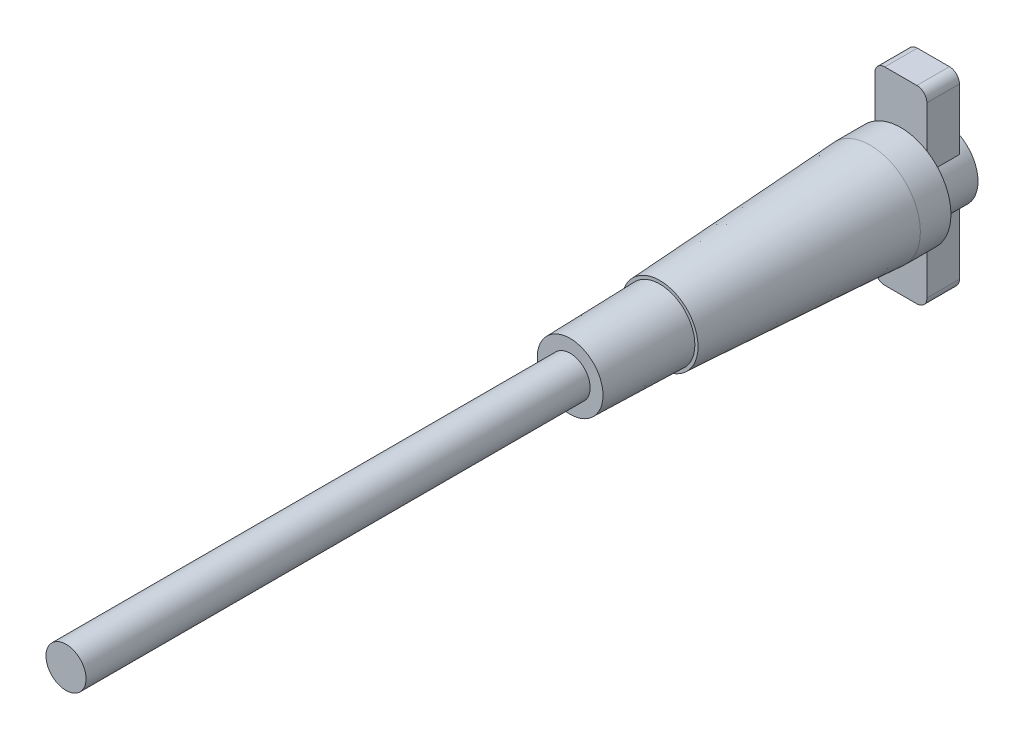
ISO-10303-21;
HEADER;
FILE_DESCRIPTION(('STEP AP214'),'2;1');
FILE_NAME('part.step','',(''),(''),'','','');
FILE_SCHEMA(('AUTOMOTIVE_DESIGN { 1 0 10303 214 1 1 1 1 }'));
ENDSEC;
DATA;
#1=APPLICATION_CONTEXT('core data for automotive mechanical design processes');
#2=APPLICATION_PROTOCOL_DEFINITION('international standard','automotive_design',2000,#1);
#3=PRODUCT_CONTEXT('',#1,'mechanical');
#4=PRODUCT('Part','Part','',(#3));
#5=PRODUCT_RELATED_PRODUCT_CATEGORY('part','',(#4));
#6=PRODUCT_DEFINITION_FORMATION('','',#4);
#7=PRODUCT_DEFINITION_CONTEXT('part definition',#1,'design');
#8=PRODUCT_DEFINITION('design','',#6,#7);
#9=PRODUCT_DEFINITION_SHAPE('','',#8);
#10=(LENGTH_UNIT() NAMED_UNIT(*) SI_UNIT(.MILLI.,.METRE.));
#11=(NAMED_UNIT(*) PLANE_ANGLE_UNIT() SI_UNIT($,.RADIAN.));
#12=(NAMED_UNIT(*) SI_UNIT($,.STERADIAN.) SOLID_ANGLE_UNIT());
#13=UNCERTAINTY_MEASURE_WITH_UNIT(LENGTH_MEASURE(1.E-05),#10,'distance_accuracy_value','');
#14=(GEOMETRIC_REPRESENTATION_CONTEXT(3) GLOBAL_UNCERTAINTY_ASSIGNED_CONTEXT((#13)) GLOBAL_UNIT_ASSIGNED_CONTEXT((#10,
#11,#12)) REPRESENTATION_CONTEXT('',''));
#15=CARTESIAN_POINT('',(0.,0.,0.));
#16=DIRECTION('',(0.,0.,1.));
#17=DIRECTION('',(1.,0.,0.));
#18=AXIS2_PLACEMENT_3D('',#15,#16,#17);
#19=CARTESIAN_POINT('',(0.,0.,88.9));
#20=DIRECTION('',(0.,0.,1.));
#21=DIRECTION('',(1.,0.,0.));
#22=AXIS2_PLACEMENT_3D('',#19,#20,#21);
#23=CYLINDRICAL_SURFACE('',#22,3.556);
#24=CARTESIAN_POINT('',(0.,0.,0.));
#25=DIRECTION('',(0.,0.,1.));
#26=DIRECTION('',(1.,0.,0.));
#27=AXIS2_PLACEMENT_3D('',#24,#25,#26);
#28=CIRCLE('',#27,3.556);
#29=CARTESIAN_POINT('',(3.556,0.,0.));
#30=VERTEX_POINT('',#29);
#31=EDGE_CURVE('E201',#30,#30,#28,.T.);
#32=ORIENTED_EDGE('',*,*,#31,.T.);
#33=EDGE_LOOP('',(#32));
#34=FACE_BOUND('',#33,.T.);
#35=DIRECTION('',(0.,0.,1.));
#36=VECTOR('',#35,1.);
#37=CARTESIAN_POINT('',(-2.6416,2.38056410121635,88.9));
#38=LINE('',#37,#36);
#39=CARTESIAN_POINT('',(-2.6416,2.38056410121635,0.965199999999999));
#40=VERTEX_POINT('',#39);
#41=CARTESIAN_POINT('',(-2.6416,2.38056410121635,4.2672));
#42=VERTEX_POINT('',#41);
#43=EDGE_CURVE('E173',#40,#42,#38,.T.);
#44=ORIENTED_EDGE('',*,*,#43,.F.);
#45=CARTESIAN_POINT('',(0.,0.,0.965199999999999));
#46=DIRECTION('',(0.,0.,-1.));
#47=DIRECTION('',(-1.,0.,0.));
#48=AXIS2_PLACEMENT_3D('',#45,#46,#47);
#49=CIRCLE('',#48,3.556);
#50=CARTESIAN_POINT('',(2.6416,2.38056410121635,0.965199999999999));
#51=VERTEX_POINT('',#50);
#52=EDGE_CURVE('E11',#40,#51,#49,.T.);
#53=ORIENTED_EDGE('',*,*,#52,.T.);
#54=DIRECTION('',(0.,0.,1.));
#55=VECTOR('',#54,1.);
#56=CARTESIAN_POINT('',(2.6416,2.38056410121635,88.9));
#57=LINE('',#56,#55);
#58=CARTESIAN_POINT('',(2.6416,2.38056410121635,4.2672));
#59=VERTEX_POINT('',#58);
#60=EDGE_CURVE('E161',#59,#51,#57,.F.);
#61=ORIENTED_EDGE('',*,*,#60,.F.);
#62=CARTESIAN_POINT('',(0.,0.,4.2672));
#63=DIRECTION('',(0.,0.,1.));
#64=DIRECTION('',(1.,0.,0.));
#65=AXIS2_PLACEMENT_3D('',#62,#63,#64);
#66=CIRCLE('',#65,3.556);
#67=CARTESIAN_POINT('',(2.6416,-2.38056410121635,4.2672));
#68=VERTEX_POINT('',#67);
#69=EDGE_CURVE('E197',#68,#59,#66,.T.);
#70=ORIENTED_EDGE('',*,*,#69,.F.);
#71=DIRECTION('',(0.,0.,1.));
#72=VECTOR('',#71,1.);
#73=CARTESIAN_POINT('',(2.6416,-2.38056410121635,88.9));
#74=LINE('',#73,#72);
#75=CARTESIAN_POINT('',(2.6416,-2.38056410121635,0.965199999999999));
#76=VERTEX_POINT('',#75);
#77=EDGE_CURVE('E164',#76,#68,#74,.T.);
#78=ORIENTED_EDGE('',*,*,#77,.F.);
#79=CARTESIAN_POINT('',(-2.6416,-2.38056410121635,0.965199999999999));
#80=VERTEX_POINT('',#79);
#81=EDGE_CURVE('E37',#76,#80,#49,.T.);
#82=ORIENTED_EDGE('',*,*,#81,.T.);
#83=DIRECTION('',(0.,0.,1.));
#84=VECTOR('',#83,1.);
#85=CARTESIAN_POINT('',(-2.6416,-2.38056410121635,88.9));
#86=LINE('',#85,#84);
#87=CARTESIAN_POINT('',(-2.6416,-2.38056410121635,4.2672));
#88=VERTEX_POINT('',#87);
#89=EDGE_CURVE('E142',#88,#80,#86,.F.);
#90=ORIENTED_EDGE('',*,*,#89,.F.);
#91=EDGE_CURVE('E200',#42,#88,#66,.T.);
#92=ORIENTED_EDGE('',*,*,#91,.F.);
#93=EDGE_LOOP('',(#44,#53,#61,#70,#78,#82,#90,#92));
#94=FACE_BOUND('',#93,.T.);
#95=ADVANCED_FACE('F33',(#34,#94),#23,.T.);
#96=CARTESIAN_POINT('',(0.,3.556,4.2672));
#97=DIRECTION('',(0.,0.,1.));
#98=DIRECTION('',(1.,0.,0.));
#99=AXIS2_PLACEMENT_3D('',#96,#97,#98);
#100=PLANE('',#99);
#101=DIRECTION('',(0.,1.,0.));
#102=VECTOR('',#101,1.);
#103=CARTESIAN_POINT('',(-2.6416,-8.5725,4.2672));
#104=LINE('',#103,#102);
#105=CARTESIAN_POINT('',(-2.6416,-4.33916460162553,4.2672));
#106=VERTEX_POINT('',#105);
#107=EDGE_CURVE('E211',#106,#88,#104,.T.);
#108=ORIENTED_EDGE('',*,*,#107,.F.);
#109=CARTESIAN_POINT('',(0.,0.,4.2672));
#110=DIRECTION('',(0.,0.,1.));
#111=DIRECTION('',(1.,0.,0.));
#112=AXIS2_PLACEMENT_3D('',#109,#110,#111);
#113=CIRCLE('',#112,5.08);
#114=CARTESIAN_POINT('',(-2.6416,4.33916460162553,4.2672));
#115=VERTEX_POINT('',#114);
#116=EDGE_CURVE('E198',#115,#106,#113,.T.);
#117=ORIENTED_EDGE('',*,*,#116,.F.);
#118=EDGE_CURVE('E56',#42,#115,#104,.T.);
#119=ORIENTED_EDGE('',*,*,#118,.F.);
#120=ORIENTED_EDGE('',*,*,#91,.T.);
#121=EDGE_LOOP('',(#108,#117,#119,#120));
#122=FACE_BOUND('',#121,.T.);
#123=ADVANCED_FACE('F209',(#122),#100,.F.);
#124=DIRECTION('',(0.,-1.,0.));
#125=VECTOR('',#124,1.);
#126=CARTESIAN_POINT('',(2.6416,-8.5725,4.2672));
#127=LINE('',#126,#125);
#128=CARTESIAN_POINT('',(2.6416,4.33916460162553,4.2672));
#129=VERTEX_POINT('',#128);
#130=EDGE_CURVE('E251',#129,#59,#127,.T.);
#131=ORIENTED_EDGE('',*,*,#130,.F.);
#132=CARTESIAN_POINT('',(2.6416,-4.33916460162553,4.2672));
#133=VERTEX_POINT('',#132);
#134=EDGE_CURVE('E193',#133,#129,#113,.T.);
#135=ORIENTED_EDGE('',*,*,#134,.F.);
#136=EDGE_CURVE('E48',#68,#133,#127,.T.);
#137=ORIENTED_EDGE('',*,*,#136,.F.);
#138=ORIENTED_EDGE('',*,*,#69,.T.);
#139=EDGE_LOOP('',(#131,#135,#137,#138));
#140=FACE_BOUND('',#139,.T.);
#141=ADVANCED_FACE('F291',(#140),#100,.F.);
#142=CARTESIAN_POINT('',(0.,0.,0.));
#143=DIRECTION('',(0.,0.,1.));
#144=DIRECTION('',(1.,0.,0.));
#145=AXIS2_PLACEMENT_3D('',#142,#143,#144);
#146=PLANE('',#145);
#147=ORIENTED_EDGE('',*,*,#31,.F.);
#148=EDGE_LOOP('',(#147));
#149=FACE_BOUND('',#148,.T.);
#150=ADVANCED_FACE('F35',(#149),#146,.F.);
#151=CARTESIAN_POINT('',(0.,0.,88.9));
#152=DIRECTION('',(0.,0.,1.));
#153=DIRECTION('',(1.,0.,0.));
#154=AXIS2_PLACEMENT_3D('',#151,#152,#153);
#155=CYLINDRICAL_SURFACE('',#154,5.08);
#156=CARTESIAN_POINT('',(0.,0.,7.366));
#157=DIRECTION('',(0.,0.,1.));
#158=DIRECTION('',(1.,0.,0.));
#159=AXIS2_PLACEMENT_3D('',#156,#157,#158);
#160=CIRCLE('',#159,5.08);
#161=CARTESIAN_POINT('',(5.08,0.,7.366));
#162=VERTEX_POINT('',#161);
#163=EDGE_CURVE('E190',#162,#162,#160,.T.);
#164=ORIENTED_EDGE('',*,*,#163,.F.);
#165=EDGE_LOOP('',(#164));
#166=FACE_BOUND('',#165,.T.);
#167=EDGE_CURVE('E194',#129,#115,#113,.T.);
#168=ORIENTED_EDGE('',*,*,#167,.T.);
#169=ORIENTED_EDGE('',*,*,#116,.T.);
#170=EDGE_CURVE('E515',#106,#133,#113,.T.);
#171=ORIENTED_EDGE('',*,*,#170,.T.);
#172=ORIENTED_EDGE('',*,*,#134,.T.);
#173=EDGE_LOOP('',(#168,#169,#171,#172));
#174=FACE_BOUND('',#173,.T.);
#175=ADVANCED_FACE('F320',(#166,#174),#155,.T.);
#176=CARTESIAN_POINT('',(0.,0.,7.366));
#177=DIRECTION('',(0.,0.,-1.));
#178=DIRECTION('',(-1.,0.,0.));
#179=AXIS2_PLACEMENT_3D('',#176,#177,#178);
#180=CONICAL_SURFACE('',#179,5.08,0.056487461574039);
#181=CARTESIAN_POINT('',(0.,0.,28.702));
#182=DIRECTION('',(0.,0.,1.));
#183=DIRECTION('',(1.,0.,0.));
#184=AXIS2_PLACEMENT_3D('',#181,#182,#183);
#185=CIRCLE('',#184,3.8735);
#186=CARTESIAN_POINT('',(3.8735,0.,28.702));
#187=VERTEX_POINT('',#186);
#188=EDGE_CURVE('E187',#187,#187,#185,.T.);
#189=ORIENTED_EDGE('',*,*,#188,.F.);
#190=EDGE_LOOP('',(#189));
#191=FACE_BOUND('',#190,.T.);
#192=ORIENTED_EDGE('',*,*,#163,.T.);
#193=EDGE_LOOP('',(#192));
#194=FACE_BOUND('',#193,.T.);
#195=ADVANCED_FACE('F323',(#191,#194),#180,.T.);
#196=CARTESIAN_POINT('',(0.,3.8735,28.702));
#197=DIRECTION('',(0.,0.,-1.));
#198=DIRECTION('',(-1.,0.,0.));
#199=AXIS2_PLACEMENT_3D('',#196,#197,#198);
#200=PLANE('',#199);
#201=CARTESIAN_POINT('',(0.,0.,28.702));
#202=DIRECTION('',(0.,0.,1.));
#203=DIRECTION('',(1.,0.,0.));
#204=AXIS2_PLACEMENT_3D('',#201,#202,#203);
#205=CIRCLE('',#204,3.556);
#206=CARTESIAN_POINT('',(3.556,0.,28.702));
#207=VERTEX_POINT('',#206);
#208=EDGE_CURVE('E184',#207,#207,#205,.T.);
#209=ORIENTED_EDGE('',*,*,#208,.F.);
#210=EDGE_LOOP('',(#209));
#211=FACE_BOUND('',#210,.T.);
#212=ORIENTED_EDGE('',*,*,#188,.T.);
#213=EDGE_LOOP('',(#212));
#214=FACE_BOUND('',#213,.T.);
#215=ADVANCED_FACE('F327',(#211,#214),#200,.F.);
#216=CARTESIAN_POINT('',(0.,0.,28.702));
#217=DIRECTION('',(0.,0.,-1.));
#218=DIRECTION('',(-1.,0.,0.));
#219=AXIS2_PLACEMENT_3D('',#216,#217,#218);
#220=CONICAL_SURFACE('',#219,3.556,0.0244364756101101);
#221=CARTESIAN_POINT('',(0.,0.,37.7952));
#222=DIRECTION('',(0.,0.,1.));
#223=DIRECTION('',(1.,0.,0.));
#224=AXIS2_PLACEMENT_3D('',#221,#222,#223);
#225=CIRCLE('',#224,3.33374999999999);
#226=CARTESIAN_POINT('',(3.33374999999999,0.,37.7952));
#227=VERTEX_POINT('',#226);
#228=EDGE_CURVE('E181',#227,#227,#225,.T.);
#229=ORIENTED_EDGE('',*,*,#228,.F.);
#230=EDGE_LOOP('',(#229));
#231=FACE_BOUND('',#230,.T.);
#232=ORIENTED_EDGE('',*,*,#208,.T.);
#233=EDGE_LOOP('',(#232));
#234=FACE_BOUND('',#233,.T.);
#235=ADVANCED_FACE('F331',(#231,#234),#220,.T.);
#236=CARTESIAN_POINT('',(0.,3.33374999999999,37.7952));
#237=DIRECTION('',(0.,0.,-1.));
#238=DIRECTION('',(-1.,0.,0.));
#239=AXIS2_PLACEMENT_3D('',#236,#237,#238);
#240=PLANE('',#239);
#241=CARTESIAN_POINT('',(0.,0.,37.7952));
#242=DIRECTION('',(0.,0.,1.));
#243=DIRECTION('',(1.,0.,0.));
#244=AXIS2_PLACEMENT_3D('',#241,#242,#243);
#245=CIRCLE('',#244,2.03200000000001);
#246=CARTESIAN_POINT('',(2.03200000000001,0.,37.7952));
#247=VERTEX_POINT('',#246);
#248=EDGE_CURVE('E178',#247,#247,#245,.T.);
#249=ORIENTED_EDGE('',*,*,#248,.F.);
#250=EDGE_LOOP('',(#249));
#251=FACE_BOUND('',#250,.T.);
#252=ORIENTED_EDGE('',*,*,#228,.T.);
#253=EDGE_LOOP('',(#252));
#254=FACE_BOUND('',#253,.T.);
#255=ADVANCED_FACE('F335',(#251,#254),#240,.F.);
#256=CARTESIAN_POINT('',(0.,0.,88.9));
#257=DIRECTION('',(0.,0.,1.));
#258=DIRECTION('',(1.,0.,0.));
#259=AXIS2_PLACEMENT_3D('',#256,#257,#258);
#260=CYLINDRICAL_SURFACE('',#259,2.032);
#261=CARTESIAN_POINT('',(0.,0.,88.9));
#262=DIRECTION('',(0.,0.,1.));
#263=DIRECTION('',(1.,0.,0.));
#264=AXIS2_PLACEMENT_3D('',#261,#262,#263);
#265=CIRCLE('',#264,2.03199999999999);
#266=CARTESIAN_POINT('',(2.03199999999999,0.,88.9));
#267=VERTEX_POINT('',#266);
#268=EDGE_CURVE('E175',#267,#267,#265,.T.);
#269=ORIENTED_EDGE('',*,*,#268,.F.);
#270=EDGE_LOOP('',(#269));
#271=FACE_BOUND('',#270,.T.);
#272=ORIENTED_EDGE('',*,*,#248,.T.);
#273=EDGE_LOOP('',(#272));
#274=FACE_BOUND('',#273,.T.);
#275=ADVANCED_FACE('F339',(#271,#274),#260,.T.);
#276=CARTESIAN_POINT('',(0.,2.03199999999999,88.9));
#277=DIRECTION('',(0.,0.,-1.));
#278=DIRECTION('',(-1.,0.,0.));
#279=AXIS2_PLACEMENT_3D('',#276,#277,#278);
#280=PLANE('',#279);
#281=ORIENTED_EDGE('',*,*,#268,.T.);
#282=EDGE_LOOP('',(#281));
#283=FACE_BOUND('',#282,.T.);
#284=ADVANCED_FACE('F311',(#283),#280,.F.);
#285=CARTESIAN_POINT('',(1.6256,-8.5725,0.965200000000001));
#286=DIRECTION('',(0.,0.,1.));
#287=DIRECTION('',(1.,0.,0.));
#288=AXIS2_PLACEMENT_3D('',#285,#286,#287);
#289=CYLINDRICAL_SURFACE('',#288,1.016);
#290=CARTESIAN_POINT('',(1.6256,-8.5725,4.2672));
#291=DIRECTION('',(0.,0.,-1.));
#292=DIRECTION('',(1.,0.,0.));
#293=AXIS2_PLACEMENT_3D('',#290,#291,#292);
#294=CIRCLE('',#293,1.016);
#295=CARTESIAN_POINT('',(2.6416,-8.5725,4.2672));
#296=VERTEX_POINT('',#295);
#297=CARTESIAN_POINT('',(1.6256,-9.5885,4.2672));
#298=VERTEX_POINT('',#297);
#299=EDGE_CURVE('E250',#296,#298,#294,.T.);
#300=ORIENTED_EDGE('',*,*,#299,.T.);
#301=DIRECTION('',(0.,0.,1.));
#302=VECTOR('',#301,1.);
#303=CARTESIAN_POINT('',(1.6256,-9.5885,0.965200000000001));
#304=LINE('',#303,#302);
#305=CARTESIAN_POINT('',(1.6256,-9.5885,0.965200000000001));
#306=VERTEX_POINT('',#305);
#307=EDGE_CURVE('E255',#306,#298,#304,.T.);
#308=ORIENTED_EDGE('',*,*,#307,.F.);
#309=CARTESIAN_POINT('',(1.6256,-8.5725,0.965200000000001));
#310=DIRECTION('',(0.,0.,-1.));
#311=DIRECTION('',(1.,0.,0.));
#312=AXIS2_PLACEMENT_3D('',#309,#310,#311);
#313=CIRCLE('',#312,1.016);
#314=CARTESIAN_POINT('',(2.6416,-8.5725,0.965200000000001));
#315=VERTEX_POINT('',#314);
#316=EDGE_CURVE('E228',#315,#306,#313,.T.);
#317=ORIENTED_EDGE('',*,*,#316,.F.);
#318=DIRECTION('',(0.,0.,1.));
#319=VECTOR('',#318,1.);
#320=CARTESIAN_POINT('',(2.6416,-8.5725,0.965200000000001));
#321=LINE('',#320,#319);
#322=EDGE_CURVE('E222',#315,#296,#321,.T.);
#323=ORIENTED_EDGE('',*,*,#322,.T.);
#324=EDGE_LOOP('',(#300,#308,#317,#323));
#325=FACE_BOUND('',#324,.T.);
#326=ADVANCED_FACE('F298',(#325),#289,.T.);
#327=CARTESIAN_POINT('',(1.6256,-9.5885,0.965200000000001));
#328=DIRECTION('',(0.,1.,0.));
#329=DIRECTION('',(0.,0.,1.));
#330=AXIS2_PLACEMENT_3D('',#327,#328,#329);
#331=PLANE('',#330);
#332=DIRECTION('',(-1.,0.,0.));
#333=VECTOR('',#332,1.);
#334=CARTESIAN_POINT('',(1.6256,-9.5885,4.2672));
#335=LINE('',#334,#333);
#336=CARTESIAN_POINT('',(-1.6256,-9.5885,4.2672));
#337=VERTEX_POINT('',#336);
#338=EDGE_CURVE('E156',#298,#337,#335,.T.);
#339=ORIENTED_EDGE('',*,*,#338,.T.);
#340=DIRECTION('',(0.,0.,1.));
#341=VECTOR('',#340,1.);
#342=CARTESIAN_POINT('',(-1.6256,-9.5885,0.965200000000001));
#343=LINE('',#342,#341);
#344=CARTESIAN_POINT('',(-1.6256,-9.5885,0.965200000000001));
#345=VERTEX_POINT('',#344);
#346=EDGE_CURVE('E235',#345,#337,#343,.T.);
#347=ORIENTED_EDGE('',*,*,#346,.F.);
#348=DIRECTION('',(-1.,0.,0.));
#349=VECTOR('',#348,1.);
#350=CARTESIAN_POINT('',(1.6256,-9.5885,0.965200000000001));
#351=LINE('',#350,#349);
#352=EDGE_CURVE('E152',#306,#345,#351,.T.);
#353=ORIENTED_EDGE('',*,*,#352,.F.);
#354=ORIENTED_EDGE('',*,*,#307,.T.);
#355=EDGE_LOOP('',(#339,#347,#353,#354));
#356=FACE_BOUND('',#355,.T.);
#357=ADVANCED_FACE('F303',(#356),#331,.F.);
#358=CARTESIAN_POINT('',(-1.6256,-8.5725,0.965200000000001));
#359=DIRECTION('',(0.,0.,1.));
#360=DIRECTION('',(1.,0.,0.));
#361=AXIS2_PLACEMENT_3D('',#358,#359,#360);
#362=CYLINDRICAL_SURFACE('',#361,1.016);
#363=CARTESIAN_POINT('',(-1.6256,-8.5725,4.2672));
#364=DIRECTION('',(0.,0.,-1.));
#365=DIRECTION('',(-1.,0.,0.));
#366=AXIS2_PLACEMENT_3D('',#363,#364,#365);
#367=CIRCLE('',#366,1.016);
#368=CARTESIAN_POINT('',(-2.6416,-8.5725,4.2672));
#369=VERTEX_POINT('',#368);
#370=EDGE_CURVE('E160',#337,#369,#367,.T.);
#371=ORIENTED_EDGE('',*,*,#370,.T.);
#372=DIRECTION('',(0.,0.,1.));
#373=VECTOR('',#372,1.);
#374=CARTESIAN_POINT('',(-2.6416,-8.5725,0.965200000000001));
#375=LINE('',#374,#373);
#376=CARTESIAN_POINT('',(-2.6416,-8.5725,0.965200000000001));
#377=VERTEX_POINT('',#376);
#378=EDGE_CURVE('E139',#377,#369,#375,.T.);
#379=ORIENTED_EDGE('',*,*,#378,.F.);
#380=CARTESIAN_POINT('',(-1.6256,-8.5725,0.965200000000001));
#381=DIRECTION('',(0.,0.,-1.));
#382=DIRECTION('',(-1.,0.,0.));
#383=AXIS2_PLACEMENT_3D('',#380,#381,#382);
#384=CIRCLE('',#383,1.016);
#385=EDGE_CURVE('E149',#345,#377,#384,.T.);
#386=ORIENTED_EDGE('',*,*,#385,.F.);
#387=ORIENTED_EDGE('',*,*,#346,.T.);
#388=EDGE_LOOP('',(#371,#379,#386,#387));
#389=FACE_BOUND('',#388,.T.);
#390=ADVANCED_FACE('F158',(#389),#362,.T.);
#391=CARTESIAN_POINT('',(-1.6256,-8.5725,4.2672));
#392=DIRECTION('',(0.,0.,-1.));
#393=DIRECTION('',(-1.,0.,0.));
#394=AXIS2_PLACEMENT_3D('',#391,#392,#393);
#395=PLANE('',#394);
#396=EDGE_CURVE('E246',#133,#296,#127,.T.);
#397=ORIENTED_EDGE('',*,*,#396,.F.);
#398=ORIENTED_EDGE('',*,*,#170,.F.);
#399=EDGE_CURVE('E238',#369,#106,#104,.T.);
#400=ORIENTED_EDGE('',*,*,#399,.F.);
#401=ORIENTED_EDGE('',*,*,#370,.F.);
#402=ORIENTED_EDGE('',*,*,#338,.F.);
#403=ORIENTED_EDGE('',*,*,#299,.F.);
#404=EDGE_LOOP('',(#397,#398,#400,#401,#402,#403));
#405=FACE_BOUND('',#404,.T.);
#406=ADVANCED_FACE('F301',(#405),#395,.F.);
#407=CARTESIAN_POINT('',(2.6416,-8.5725,0.965200000000001));
#408=DIRECTION('',(-1.,0.,0.));
#409=DIRECTION('',(0.,0.,1.));
#410=AXIS2_PLACEMENT_3D('',#407,#408,#409);
#411=PLANE('',#410);
#412=DIRECTION('',(0.,-1.,0.));
#413=VECTOR('',#412,1.);
#414=CARTESIAN_POINT('',(2.6416,-8.5725,0.965200000000001));
#415=LINE('',#414,#413);
#416=EDGE_CURVE('E218',#76,#315,#415,.T.);
#417=ORIENTED_EDGE('',*,*,#416,.F.);
#418=ORIENTED_EDGE('',*,*,#77,.T.);
#419=ORIENTED_EDGE('',*,*,#136,.T.);
#420=ORIENTED_EDGE('',*,*,#396,.T.);
#421=ORIENTED_EDGE('',*,*,#322,.F.);
#422=EDGE_LOOP('',(#417,#418,#419,#420,#421));
#423=FACE_BOUND('',#422,.T.);
#424=ADVANCED_FACE('F220',(#423),#411,.F.);
#425=CARTESIAN_POINT('',(-2.6416,-8.5725,0.965200000000001));
#426=DIRECTION('',(1.,0.,0.));
#427=DIRECTION('',(0.,0.,-1.));
#428=AXIS2_PLACEMENT_3D('',#425,#426,#427);
#429=PLANE('',#428);
#430=ORIENTED_EDGE('',*,*,#107,.T.);
#431=ORIENTED_EDGE('',*,*,#89,.T.);
#432=DIRECTION('',(0.,1.,0.));
#433=VECTOR('',#432,1.);
#434=CARTESIAN_POINT('',(-2.6416,-8.5725,0.965200000000001));
#435=LINE('',#434,#433);
#436=EDGE_CURVE('E134',#377,#80,#435,.T.);
#437=ORIENTED_EDGE('',*,*,#436,.F.);
#438=ORIENTED_EDGE('',*,*,#378,.T.);
#439=ORIENTED_EDGE('',*,*,#399,.T.);
#440=EDGE_LOOP('',(#430,#431,#437,#438,#439));
#441=FACE_BOUND('',#440,.T.);
#442=ADVANCED_FACE('F136',(#441),#429,.F.);
#443=CARTESIAN_POINT('',(-1.6256,-8.5725,0.965200000000001));
#444=DIRECTION('',(0.,0.,-1.));
#445=DIRECTION('',(-1.,0.,0.));
#446=AXIS2_PLACEMENT_3D('',#443,#444,#445);
#447=PLANE('',#446);
#448=ORIENTED_EDGE('',*,*,#81,.F.);
#449=ORIENTED_EDGE('',*,*,#416,.T.);
#450=ORIENTED_EDGE('',*,*,#316,.T.);
#451=ORIENTED_EDGE('',*,*,#352,.T.);
#452=ORIENTED_EDGE('',*,*,#385,.T.);
#453=ORIENTED_EDGE('',*,*,#436,.T.);
#454=EDGE_LOOP('',(#448,#449,#450,#451,#452,#453));
#455=FACE_BOUND('',#454,.T.);
#456=ADVANCED_FACE('F150',(#455),#447,.T.);
#457=ORIENTED_EDGE('',*,*,#52,.F.);
#458=CARTESIAN_POINT('',(-2.6416,8.5725,0.965200000000001));
#459=VERTEX_POINT('',#458);
#460=EDGE_CURVE('E146',#40,#459,#435,.T.);
#461=ORIENTED_EDGE('',*,*,#460,.T.);
#462=CARTESIAN_POINT('',(-1.6256,8.5725,0.965200000000001));
#463=DIRECTION('',(0.,0.,-1.));
#464=DIRECTION('',(1.,0.,0.));
#465=AXIS2_PLACEMENT_3D('',#462,#463,#464);
#466=CIRCLE('',#465,1.016);
#467=CARTESIAN_POINT('',(-1.6256,9.5885,0.965200000000001));
#468=VERTEX_POINT('',#467);
#469=EDGE_CURVE('E145',#459,#468,#466,.T.);
#470=ORIENTED_EDGE('',*,*,#469,.T.);
#471=DIRECTION('',(1.,0.,0.));
#472=VECTOR('',#471,1.);
#473=CARTESIAN_POINT('',(1.6256,9.5885,0.965200000000001));
#474=LINE('',#473,#472);
#475=CARTESIAN_POINT('',(1.6256,9.5885,0.965200000000001));
#476=VERTEX_POINT('',#475);
#477=EDGE_CURVE('E229',#468,#476,#474,.T.);
#478=ORIENTED_EDGE('',*,*,#477,.T.);
#479=CARTESIAN_POINT('',(1.6256,8.5725,0.965200000000001));
#480=DIRECTION('',(0.,0.,-1.));
#481=DIRECTION('',(1.,0.,0.));
#482=AXIS2_PLACEMENT_3D('',#479,#480,#481);
#483=CIRCLE('',#482,1.016);
#484=CARTESIAN_POINT('',(2.6416,8.5725,0.965200000000001));
#485=VERTEX_POINT('',#484);
#486=EDGE_CURVE('E225',#476,#485,#483,.T.);
#487=ORIENTED_EDGE('',*,*,#486,.T.);
#488=EDGE_CURVE('E224',#485,#51,#415,.T.);
#489=ORIENTED_EDGE('',*,*,#488,.T.);
#490=EDGE_LOOP('',(#457,#461,#470,#478,#487,#489));
#491=FACE_BOUND('',#490,.T.);
#492=ADVANCED_FACE('F288',(#491),#447,.T.);
#493=ORIENTED_EDGE('',*,*,#460,.F.);
#494=ORIENTED_EDGE('',*,*,#43,.T.);
#495=ORIENTED_EDGE('',*,*,#118,.T.);
#496=CARTESIAN_POINT('',(-2.6416,8.5725,4.2672));
#497=VERTEX_POINT('',#496);
#498=EDGE_CURVE('E237',#115,#497,#104,.T.);
#499=ORIENTED_EDGE('',*,*,#498,.T.);
#500=DIRECTION('',(0.,0.,1.));
#501=VECTOR('',#500,1.);
#502=CARTESIAN_POINT('',(-2.6416,8.5725,0.965200000000001));
#503=LINE('',#502,#501);
#504=EDGE_CURVE('E162',#459,#497,#503,.T.);
#505=ORIENTED_EDGE('',*,*,#504,.F.);
#506=EDGE_LOOP('',(#493,#494,#495,#499,#505));
#507=FACE_BOUND('',#506,.T.);
#508=ADVANCED_FACE('F347',(#507),#429,.F.);
#509=ORIENTED_EDGE('',*,*,#130,.T.);
#510=ORIENTED_EDGE('',*,*,#60,.T.);
#511=ORIENTED_EDGE('',*,*,#488,.F.);
#512=DIRECTION('',(0.,0.,1.));
#513=VECTOR('',#512,1.);
#514=CARTESIAN_POINT('',(2.6416,8.5725,0.965200000000001));
#515=LINE('',#514,#513);
#516=CARTESIAN_POINT('',(2.6416,8.5725,4.2672));
#517=VERTEX_POINT('',#516);
#518=EDGE_CURVE('E259',#485,#517,#515,.T.);
#519=ORIENTED_EDGE('',*,*,#518,.T.);
#520=EDGE_CURVE('E247',#517,#129,#127,.T.);
#521=ORIENTED_EDGE('',*,*,#520,.T.);
#522=EDGE_LOOP('',(#509,#510,#511,#519,#521));
#523=FACE_BOUND('',#522,.T.);
#524=ADVANCED_FACE('F284',(#523),#411,.F.);
#525=ORIENTED_EDGE('',*,*,#498,.F.);
#526=ORIENTED_EDGE('',*,*,#167,.F.);
#527=ORIENTED_EDGE('',*,*,#520,.F.);
#528=CARTESIAN_POINT('',(1.6256,8.5725,4.2672));
#529=DIRECTION('',(0.,0.,-1.));
#530=DIRECTION('',(1.,0.,0.));
#531=AXIS2_PLACEMENT_3D('',#528,#529,#530);
#532=CIRCLE('',#531,1.016);
#533=CARTESIAN_POINT('',(1.6256,9.5885,4.2672));
#534=VERTEX_POINT('',#533);
#535=EDGE_CURVE('E244',#534,#517,#532,.T.);
#536=ORIENTED_EDGE('',*,*,#535,.F.);
#537=DIRECTION('',(1.,0.,0.));
#538=VECTOR('',#537,1.);
#539=CARTESIAN_POINT('',(1.6256,9.5885,4.2672));
#540=LINE('',#539,#538);
#541=CARTESIAN_POINT('',(-1.6256,9.5885,4.2672));
#542=VERTEX_POINT('',#541);
#543=EDGE_CURVE('E242',#542,#534,#540,.T.);
#544=ORIENTED_EDGE('',*,*,#543,.F.);
#545=CARTESIAN_POINT('',(-1.6256,8.5725,4.2672));
#546=DIRECTION('',(0.,0.,-1.));
#547=DIRECTION('',(1.,0.,0.));
#548=AXIS2_PLACEMENT_3D('',#545,#546,#547);
#549=CIRCLE('',#548,1.016);
#550=EDGE_CURVE('E240',#497,#542,#549,.T.);
#551=ORIENTED_EDGE('',*,*,#550,.F.);
#552=EDGE_LOOP('',(#525,#526,#527,#536,#544,#551));
#553=FACE_BOUND('',#552,.T.);
#554=ADVANCED_FACE('F276',(#553),#395,.F.);
#555=CARTESIAN_POINT('',(-1.6256,8.5725,0.965200000000001));
#556=DIRECTION('',(0.,0.,1.));
#557=DIRECTION('',(1.,0.,0.));
#558=AXIS2_PLACEMENT_3D('',#555,#556,#557);
#559=CYLINDRICAL_SURFACE('',#558,1.016);
#560=ORIENTED_EDGE('',*,*,#550,.T.);
#561=DIRECTION('',(0.,0.,1.));
#562=VECTOR('',#561,1.);
#563=CARTESIAN_POINT('',(-1.6256,9.5885,0.965200000000001));
#564=LINE('',#563,#562);
#565=EDGE_CURVE('E167',#468,#542,#564,.T.);
#566=ORIENTED_EDGE('',*,*,#565,.F.);
#567=ORIENTED_EDGE('',*,*,#469,.F.);
#568=ORIENTED_EDGE('',*,*,#504,.T.);
#569=EDGE_LOOP('',(#560,#566,#567,#568));
#570=FACE_BOUND('',#569,.T.);
#571=ADVANCED_FACE('F350',(#570),#559,.T.);
#572=CARTESIAN_POINT('',(1.6256,9.5885,0.965200000000001));
#573=DIRECTION('',(0.,-1.,0.));
#574=DIRECTION('',(0.,0.,-1.));
#575=AXIS2_PLACEMENT_3D('',#572,#573,#574);
#576=PLANE('',#575);
#577=ORIENTED_EDGE('',*,*,#543,.T.);
#578=DIRECTION('',(0.,0.,1.));
#579=VECTOR('',#578,1.);
#580=CARTESIAN_POINT('',(1.6256,9.5885,0.965200000000001));
#581=LINE('',#580,#579);
#582=EDGE_CURVE('E262',#476,#534,#581,.T.);
#583=ORIENTED_EDGE('',*,*,#582,.F.);
#584=ORIENTED_EDGE('',*,*,#477,.F.);
#585=ORIENTED_EDGE('',*,*,#565,.T.);
#586=EDGE_LOOP('',(#577,#583,#584,#585));
#587=FACE_BOUND('',#586,.T.);
#588=ADVANCED_FACE('F269',(#587),#576,.F.);
#589=CARTESIAN_POINT('',(1.6256,8.5725,0.965200000000001));
#590=DIRECTION('',(0.,0.,1.));
#591=DIRECTION('',(1.,0.,0.));
#592=AXIS2_PLACEMENT_3D('',#589,#590,#591);
#593=CYLINDRICAL_SURFACE('',#592,1.016);
#594=ORIENTED_EDGE('',*,*,#535,.T.);
#595=ORIENTED_EDGE('',*,*,#518,.F.);
#596=ORIENTED_EDGE('',*,*,#486,.F.);
#597=ORIENTED_EDGE('',*,*,#582,.T.);
#598=EDGE_LOOP('',(#594,#595,#596,#597));
#599=FACE_BOUND('',#598,.T.);
#600=ADVANCED_FACE('F280',(#599),#593,.T.);
#601=CLOSED_SHELL('',(#95,#123,#141,#150,#175,#195,#215,#235,#255,#275,#284,#326,#357,#390,#406,
#424,#442,#456,#492,#508,#524,#554,#571,#588,#600));
#602=MANIFOLD_SOLID_BREP('B2',#601);
#603=ADVANCED_BREP_SHAPE_REPRESENTATION('',(#18,#602),#14);
#604=SHAPE_DEFINITION_REPRESENTATION(#9,#603);
ENDSEC;
END-ISO-10303-21;
